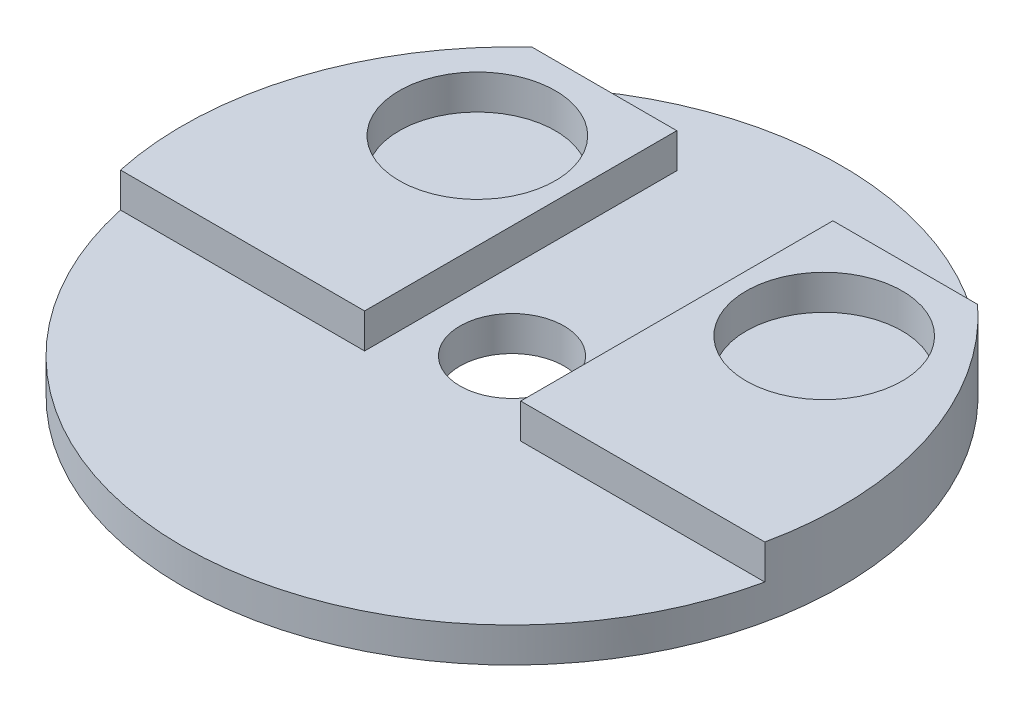
ISO-10303-21;
HEADER;
FILE_DESCRIPTION(('STEP AP214'),'2;1');
FILE_NAME('part.step','',(''),(''),'','','');
FILE_SCHEMA(('AUTOMOTIVE_DESIGN { 1 0 10303 214 1 1 1 1 }'));
ENDSEC;
DATA;
#1=APPLICATION_CONTEXT('core data for automotive mechanical design processes');
#2=APPLICATION_PROTOCOL_DEFINITION('international standard','automotive_design',2000,#1);
#3=PRODUCT_CONTEXT('',#1,'mechanical');
#4=PRODUCT('Part','Part','',(#3));
#5=PRODUCT_RELATED_PRODUCT_CATEGORY('part','',(#4));
#6=PRODUCT_DEFINITION_FORMATION('','',#4);
#7=PRODUCT_DEFINITION_CONTEXT('part definition',#1,'design');
#8=PRODUCT_DEFINITION('design','',#6,#7);
#9=PRODUCT_DEFINITION_SHAPE('','',#8);
#10=(LENGTH_UNIT() NAMED_UNIT(*) SI_UNIT(.MILLI.,.METRE.));
#11=(NAMED_UNIT(*) PLANE_ANGLE_UNIT() SI_UNIT($,.RADIAN.));
#12=(NAMED_UNIT(*) SI_UNIT($,.STERADIAN.) SOLID_ANGLE_UNIT());
#13=UNCERTAINTY_MEASURE_WITH_UNIT(LENGTH_MEASURE(1.E-05),#10,'distance_accuracy_value','');
#14=(GEOMETRIC_REPRESENTATION_CONTEXT(3) GLOBAL_UNCERTAINTY_ASSIGNED_CONTEXT((#13)) GLOBAL_UNIT_ASSIGNED_CONTEXT((#10,
#11,#12)) REPRESENTATION_CONTEXT('',''));
#15=CARTESIAN_POINT('',(0.,0.,0.));
#16=DIRECTION('',(0.,0.,1.));
#17=DIRECTION('',(1.,0.,0.));
#18=AXIS2_PLACEMENT_3D('',#15,#16,#17);
#19=CARTESIAN_POINT('',(0.,0.,0.));
#20=DIRECTION('',(0.,1.,0.));
#21=DIRECTION('',(0.,0.,1.));
#22=AXIS2_PLACEMENT_3D('',#19,#20,#21);
#23=PLANE('',#22);
#24=DIRECTION('',(1.,0.,0.));
#25=VECTOR('',#24,1.);
#26=CARTESIAN_POINT('',(0.,0.,-3.5));
#27=LINE('',#26,#25);
#28=CARTESIAN_POINT('',(-3.21130814466628,0.,-3.5));
#29=VERTEX_POINT('',#28);
#30=CARTESIAN_POINT('',(-1.125,0.,-3.5));
#31=VERTEX_POINT('',#30);
#32=EDGE_CURVE('E59',#29,#31,#27,.T.);
#33=ORIENTED_EDGE('',*,*,#32,.T.);
#34=DIRECTION('',(0.,0.,1.));
#35=VECTOR('',#34,1.);
#36=CARTESIAN_POINT('',(-1.125,0.,0.));
#37=LINE('',#36,#35);
#38=CARTESIAN_POINT('',(-1.125,0.,1.));
#39=VERTEX_POINT('',#38);
#40=EDGE_CURVE('E64',#31,#39,#37,.T.);
#41=ORIENTED_EDGE('',*,*,#40,.T.);
#42=DIRECTION('',(-1.,0.,0.));
#43=VECTOR('',#42,1.);
#44=CARTESIAN_POINT('',(0.,0.,1.));
#45=LINE('',#44,#43);
#46=CARTESIAN_POINT('',(-4.64354390525168,0.,1.));
#47=VERTEX_POINT('',#46);
#48=EDGE_CURVE('E140',#39,#47,#45,.T.);
#49=ORIENTED_EDGE('',*,*,#48,.T.);
#50=CARTESIAN_POINT('',(0.,0.,0.));
#51=DIRECTION('',(0.,1.,0.));
#52=DIRECTION('',(0.,0.,1.));
#53=AXIS2_PLACEMENT_3D('',#50,#51,#52);
#54=CIRCLE('',#53,4.75);
#55=CARTESIAN_POINT('',(4.64354390525168,0.,1.));
#56=VERTEX_POINT('',#55);
#57=EDGE_CURVE('E184',#47,#56,#54,.T.);
#58=ORIENTED_EDGE('',*,*,#57,.T.);
#59=DIRECTION('',(-1.,0.,0.));
#60=VECTOR('',#59,1.);
#61=CARTESIAN_POINT('',(0.,0.,1.));
#62=LINE('',#61,#60);
#63=CARTESIAN_POINT('',(1.125,0.,1.));
#64=VERTEX_POINT('',#63);
#65=EDGE_CURVE('E164',#56,#64,#62,.T.);
#66=ORIENTED_EDGE('',*,*,#65,.T.);
#67=DIRECTION('',(0.,0.,1.));
#68=VECTOR('',#67,1.);
#69=CARTESIAN_POINT('',(1.125,0.,0.));
#70=LINE('',#69,#68);
#71=CARTESIAN_POINT('',(1.125,0.,-3.5));
#72=VERTEX_POINT('',#71);
#73=EDGE_CURVE('E151',#72,#64,#70,.T.);
#74=ORIENTED_EDGE('',*,*,#73,.F.);
#75=DIRECTION('',(1.,0.,0.));
#76=VECTOR('',#75,1.);
#77=CARTESIAN_POINT('',(0.,0.,-3.5));
#78=LINE('',#77,#76);
#79=CARTESIAN_POINT('',(3.21130814466628,0.,-3.5));
#80=VERTEX_POINT('',#79);
#81=EDGE_CURVE('E167',#72,#80,#78,.T.);
#82=ORIENTED_EDGE('',*,*,#81,.T.);
#83=EDGE_CURVE('E188',#80,#29,#54,.T.);
#84=ORIENTED_EDGE('',*,*,#83,.T.);
#85=EDGE_LOOP('',(#33,#41,#49,#58,#66,#74,#82,#84));
#86=FACE_BOUND('',#85,.T.);
#87=CARTESIAN_POINT('',(0.,0.,0.));
#88=DIRECTION('',(0.,1.,0.));
#89=DIRECTION('',(0.,0.,1.));
#90=AXIS2_PLACEMENT_3D('',#87,#88,#89);
#91=CIRCLE('',#90,0.75);
#92=CARTESIAN_POINT('',(0.,0.,0.75));
#93=VERTEX_POINT('',#92);
#94=EDGE_CURVE('E180',#93,#93,#91,.T.);
#95=ORIENTED_EDGE('',*,*,#94,.F.);
#96=EDGE_LOOP('',(#95));
#97=FACE_BOUND('',#96,.T.);
#98=ADVANCED_FACE('F44',(#86,#97),#23,.T.);
#99=CARTESIAN_POINT('',(0.,-0.5,0.));
#100=DIRECTION('',(0.,1.,0.));
#101=DIRECTION('',(0.,0.,1.));
#102=AXIS2_PLACEMENT_3D('',#99,#100,#101);
#103=CYLINDRICAL_SURFACE('',#102,4.75);
#104=CARTESIAN_POINT('',(0.,-0.5,0.));
#105=DIRECTION('',(0.,1.,0.));
#106=DIRECTION('',(0.,0.,1.));
#107=AXIS2_PLACEMENT_3D('',#104,#105,#106);
#108=CIRCLE('',#107,4.75);
#109=CARTESIAN_POINT('',(0.,-0.5,4.75));
#110=VERTEX_POINT('',#109);
#111=EDGE_CURVE('E52',#110,#110,#108,.T.);
#112=ORIENTED_EDGE('',*,*,#111,.T.);
#113=EDGE_LOOP('',(#112));
#114=FACE_BOUND('',#113,.T.);
#115=ORIENTED_EDGE('',*,*,#83,.F.);
#116=DIRECTION('',(0.,-1.,0.));
#117=VECTOR('',#116,1.);
#118=CARTESIAN_POINT('',(3.21130814466628,0.5,-3.5));
#119=LINE('',#118,#117);
#120=CARTESIAN_POINT('',(3.21130814466628,0.5,-3.5));
#121=VERTEX_POINT('',#120);
#122=EDGE_CURVE('E175',#121,#80,#119,.T.);
#123=ORIENTED_EDGE('',*,*,#122,.F.);
#124=CARTESIAN_POINT('',(0.,0.5,0.));
#125=DIRECTION('',(0.,1.,0.));
#126=DIRECTION('',(0.,0.,1.));
#127=AXIS2_PLACEMENT_3D('',#124,#125,#126);
#128=CIRCLE('',#127,4.75);
#129=CARTESIAN_POINT('',(4.64354390525168,0.5,1.));
#130=VERTEX_POINT('',#129);
#131=EDGE_CURVE('E154',#130,#121,#128,.T.);
#132=ORIENTED_EDGE('',*,*,#131,.F.);
#133=DIRECTION('',(0.,-1.,0.));
#134=VECTOR('',#133,1.);
#135=CARTESIAN_POINT('',(4.64354390525168,0.5,1.));
#136=LINE('',#135,#134);
#137=EDGE_CURVE('E177',#130,#56,#136,.T.);
#138=ORIENTED_EDGE('',*,*,#137,.T.);
#139=ORIENTED_EDGE('',*,*,#57,.F.);
#140=DIRECTION('',(0.,-1.,0.));
#141=VECTOR('',#140,1.);
#142=CARTESIAN_POINT('',(-4.64354390525168,0.5,1.));
#143=LINE('',#142,#141);
#144=CARTESIAN_POINT('',(-4.64354390525168,0.5,1.));
#145=VERTEX_POINT('',#144);
#146=EDGE_CURVE('E118',#145,#47,#143,.T.);
#147=ORIENTED_EDGE('',*,*,#146,.F.);
#148=CARTESIAN_POINT('',(0.,0.5,0.));
#149=DIRECTION('',(0.,1.,0.));
#150=DIRECTION('',(0.,0.,1.));
#151=AXIS2_PLACEMENT_3D('',#148,#149,#150);
#152=CIRCLE('',#151,4.75);
#153=CARTESIAN_POINT('',(-3.21130814466628,0.5,-3.5));
#154=VERTEX_POINT('',#153);
#155=EDGE_CURVE('E121',#154,#145,#152,.T.);
#156=ORIENTED_EDGE('',*,*,#155,.F.);
#157=DIRECTION('',(0.,-1.,0.));
#158=VECTOR('',#157,1.);
#159=CARTESIAN_POINT('',(-3.21130814466628,0.5,-3.5));
#160=LINE('',#159,#158);
#161=EDGE_CURVE('E109',#154,#29,#160,.T.);
#162=ORIENTED_EDGE('',*,*,#161,.T.);
#163=EDGE_LOOP('',(#115,#123,#132,#138,#139,#147,#156,#162));
#164=FACE_BOUND('',#163,.T.);
#165=ADVANCED_FACE('F46',(#114,#164),#103,.T.);
#166=CARTESIAN_POINT('',(0.,-0.5,0.));
#167=DIRECTION('',(0.,1.,0.));
#168=DIRECTION('',(0.,0.,1.));
#169=AXIS2_PLACEMENT_3D('',#166,#167,#168);
#170=PLANE('',#169);
#171=CARTESIAN_POINT('',(0.,-0.5,0.));
#172=DIRECTION('',(0.,1.,0.));
#173=DIRECTION('',(0.,0.,1.));
#174=AXIS2_PLACEMENT_3D('',#171,#172,#173);
#175=CIRCLE('',#174,0.75);
#176=CARTESIAN_POINT('',(0.,-0.5,0.75));
#177=VERTEX_POINT('',#176);
#178=EDGE_CURVE('E181',#177,#177,#175,.T.);
#179=ORIENTED_EDGE('',*,*,#178,.T.);
#180=EDGE_LOOP('',(#179));
#181=FACE_BOUND('',#180,.T.);
#182=ORIENTED_EDGE('',*,*,#111,.F.);
#183=EDGE_LOOP('',(#182));
#184=FACE_BOUND('',#183,.T.);
#185=ADVANCED_FACE('F226',(#181,#184),#170,.F.);
#186=CARTESIAN_POINT('',(0.,-0.5,0.));
#187=DIRECTION('',(0.,1.,0.));
#188=DIRECTION('',(0.,0.,1.));
#189=AXIS2_PLACEMENT_3D('',#186,#187,#188);
#190=CYLINDRICAL_SURFACE('',#189,0.75);
#191=ORIENTED_EDGE('',*,*,#178,.F.);
#192=EDGE_LOOP('',(#191));
#193=FACE_BOUND('',#192,.T.);
#194=ORIENTED_EDGE('',*,*,#94,.T.);
#195=EDGE_LOOP('',(#194));
#196=FACE_BOUND('',#195,.T.);
#197=ADVANCED_FACE('F307',(#193,#196),#190,.F.);
#198=CARTESIAN_POINT('',(0.,0.5,1.));
#199=DIRECTION('',(0.,0.,1.));
#200=DIRECTION('',(1.,0.,0.));
#201=AXIS2_PLACEMENT_3D('',#198,#199,#200);
#202=PLANE('',#201);
#203=ORIENTED_EDGE('',*,*,#65,.F.);
#204=ORIENTED_EDGE('',*,*,#137,.F.);
#205=DIRECTION('',(-1.,0.,0.));
#206=VECTOR('',#205,1.);
#207=CARTESIAN_POINT('',(0.,0.5,1.));
#208=LINE('',#207,#206);
#209=CARTESIAN_POINT('',(1.125,0.5,1.));
#210=VERTEX_POINT('',#209);
#211=EDGE_CURVE('E150',#130,#210,#208,.T.);
#212=ORIENTED_EDGE('',*,*,#211,.T.);
#213=DIRECTION('',(0.,-1.,0.));
#214=VECTOR('',#213,1.);
#215=CARTESIAN_POINT('',(1.125,0.5,1.));
#216=LINE('',#215,#214);
#217=EDGE_CURVE('E161',#210,#64,#216,.T.);
#218=ORIENTED_EDGE('',*,*,#217,.T.);
#219=EDGE_LOOP('',(#203,#204,#212,#218));
#220=FACE_BOUND('',#219,.T.);
#221=ADVANCED_FACE('F197',(#220),#202,.T.);
#222=CARTESIAN_POINT('',(0.,0.5,-3.5));
#223=DIRECTION('',(0.,0.,-1.));
#224=DIRECTION('',(-1.,0.,0.));
#225=AXIS2_PLACEMENT_3D('',#222,#223,#224);
#226=PLANE('',#225);
#227=ORIENTED_EDGE('',*,*,#81,.F.);
#228=DIRECTION('',(0.,-1.,0.));
#229=VECTOR('',#228,1.);
#230=CARTESIAN_POINT('',(1.125,0.5,-3.5));
#231=LINE('',#230,#229);
#232=CARTESIAN_POINT('',(1.125,0.5,-3.5));
#233=VERTEX_POINT('',#232);
#234=EDGE_CURVE('E173',#233,#72,#231,.T.);
#235=ORIENTED_EDGE('',*,*,#234,.F.);
#236=DIRECTION('',(1.,0.,0.));
#237=VECTOR('',#236,1.);
#238=CARTESIAN_POINT('',(0.,0.5,-3.5));
#239=LINE('',#238,#237);
#240=EDGE_CURVE('E156',#233,#121,#239,.T.);
#241=ORIENTED_EDGE('',*,*,#240,.T.);
#242=ORIENTED_EDGE('',*,*,#122,.T.);
#243=EDGE_LOOP('',(#227,#235,#241,#242));
#244=FACE_BOUND('',#243,.T.);
#245=ADVANCED_FACE('F205',(#244),#226,.T.);
#246=CARTESIAN_POINT('',(2.5,0.5,-2.));
#247=DIRECTION('',(0.,-1.,0.));
#248=DIRECTION('',(0.,0.,-1.));
#249=AXIS2_PLACEMENT_3D('',#246,#247,#248);
#250=CYLINDRICAL_SURFACE('',#249,1.125);
#251=CARTESIAN_POINT('',(2.5,0.5,-2.));
#252=DIRECTION('',(0.,1.,0.));
#253=DIRECTION('',(0.,0.,1.));
#254=AXIS2_PLACEMENT_3D('',#251,#252,#253);
#255=CIRCLE('',#254,1.125);
#256=CARTESIAN_POINT('',(2.5,0.5,-0.874999999999999));
#257=VERTEX_POINT('',#256);
#258=EDGE_CURVE('E147',#257,#257,#255,.T.);
#259=ORIENTED_EDGE('',*,*,#258,.T.);
#260=EDGE_LOOP('',(#259));
#261=FACE_BOUND('',#260,.T.);
#262=CARTESIAN_POINT('',(2.5,0.,-2.));
#263=DIRECTION('',(0.,1.,0.));
#264=DIRECTION('',(0.,0.,1.));
#265=AXIS2_PLACEMENT_3D('',#262,#263,#264);
#266=CIRCLE('',#265,1.125);
#267=CARTESIAN_POINT('',(2.5,0.,-0.874999999999999));
#268=VERTEX_POINT('',#267);
#269=EDGE_CURVE('E117',#268,#268,#266,.T.);
#270=ORIENTED_EDGE('',*,*,#269,.F.);
#271=EDGE_LOOP('',(#270));
#272=FACE_BOUND('',#271,.T.);
#273=ADVANCED_FACE('F218',(#261,#272),#250,.F.);
#274=CARTESIAN_POINT('',(1.125,0.5,0.));
#275=DIRECTION('',(1.,0.,0.));
#276=DIRECTION('',(0.,0.,-1.));
#277=AXIS2_PLACEMENT_3D('',#274,#275,#276);
#278=PLANE('',#277);
#279=ORIENTED_EDGE('',*,*,#73,.T.);
#280=ORIENTED_EDGE('',*,*,#217,.F.);
#281=DIRECTION('',(0.,0.,1.));
#282=VECTOR('',#281,1.);
#283=CARTESIAN_POINT('',(1.125,0.5,0.));
#284=LINE('',#283,#282);
#285=EDGE_CURVE('E159',#233,#210,#284,.T.);
#286=ORIENTED_EDGE('',*,*,#285,.F.);
#287=ORIENTED_EDGE('',*,*,#234,.T.);
#288=EDGE_LOOP('',(#279,#280,#286,#287));
#289=FACE_BOUND('',#288,.T.);
#290=ADVANCED_FACE('F201',(#289),#278,.F.);
#291=CARTESIAN_POINT('',(0.,0.5,0.));
#292=DIRECTION('',(0.,1.,0.));
#293=DIRECTION('',(0.,0.,1.));
#294=AXIS2_PLACEMENT_3D('',#291,#292,#293);
#295=PLANE('',#294);
#296=ORIENTED_EDGE('',*,*,#258,.F.);
#297=EDGE_LOOP('',(#296));
#298=FACE_BOUND('',#297,.T.);
#299=ORIENTED_EDGE('',*,*,#211,.F.);
#300=ORIENTED_EDGE('',*,*,#131,.T.);
#301=ORIENTED_EDGE('',*,*,#240,.F.);
#302=ORIENTED_EDGE('',*,*,#285,.T.);
#303=EDGE_LOOP('',(#299,#300,#301,#302));
#304=FACE_BOUND('',#303,.T.);
#305=ADVANCED_FACE('F207',(#298,#304),#295,.T.);
#306=ORIENTED_EDGE('',*,*,#269,.T.);
#307=EDGE_LOOP('',(#306));
#308=FACE_BOUND('',#307,.T.);
#309=ADVANCED_FACE('F209',(#308),#23,.T.);
#310=CARTESIAN_POINT('',(0.,0.5,-3.5));
#311=DIRECTION('',(0.,0.,-1.));
#312=DIRECTION('',(-1.,0.,0.));
#313=AXIS2_PLACEMENT_3D('',#310,#311,#312);
#314=PLANE('',#313);
#315=ORIENTED_EDGE('',*,*,#32,.F.);
#316=ORIENTED_EDGE('',*,*,#161,.F.);
#317=DIRECTION('',(1.,0.,0.));
#318=VECTOR('',#317,1.);
#319=CARTESIAN_POINT('',(0.,0.5,-3.5));
#320=LINE('',#319,#318);
#321=CARTESIAN_POINT('',(-1.125,0.5,-3.5));
#322=VERTEX_POINT('',#321);
#323=EDGE_CURVE('E113',#154,#322,#320,.T.);
#324=ORIENTED_EDGE('',*,*,#323,.T.);
#325=DIRECTION('',(0.,-1.,0.));
#326=VECTOR('',#325,1.);
#327=CARTESIAN_POINT('',(-1.125,0.5,-3.5));
#328=LINE('',#327,#326);
#329=EDGE_CURVE('E138',#322,#31,#328,.T.);
#330=ORIENTED_EDGE('',*,*,#329,.T.);
#331=EDGE_LOOP('',(#315,#316,#324,#330));
#332=FACE_BOUND('',#331,.T.);
#333=ADVANCED_FACE('F111',(#332),#314,.T.);
#334=CARTESIAN_POINT('',(0.,0.5,1.));
#335=DIRECTION('',(0.,0.,1.));
#336=DIRECTION('',(1.,0.,0.));
#337=AXIS2_PLACEMENT_3D('',#334,#335,#336);
#338=PLANE('',#337);
#339=ORIENTED_EDGE('',*,*,#48,.F.);
#340=DIRECTION('',(0.,-1.,0.));
#341=VECTOR('',#340,1.);
#342=CARTESIAN_POINT('',(-1.125,0.5,1.));
#343=LINE('',#342,#341);
#344=CARTESIAN_POINT('',(-1.125,0.5,1.));
#345=VERTEX_POINT('',#344);
#346=EDGE_CURVE('E144',#345,#39,#343,.T.);
#347=ORIENTED_EDGE('',*,*,#346,.F.);
#348=DIRECTION('',(-1.,0.,0.));
#349=VECTOR('',#348,1.);
#350=CARTESIAN_POINT('',(0.,0.5,1.));
#351=LINE('',#350,#349);
#352=EDGE_CURVE('E126',#345,#145,#351,.T.);
#353=ORIENTED_EDGE('',*,*,#352,.T.);
#354=ORIENTED_EDGE('',*,*,#146,.T.);
#355=EDGE_LOOP('',(#339,#347,#353,#354));
#356=FACE_BOUND('',#355,.T.);
#357=ADVANCED_FACE('F241',(#356),#338,.T.);
#358=CARTESIAN_POINT('',(-2.5,0.5,-2.));
#359=DIRECTION('',(0.,-1.,0.));
#360=DIRECTION('',(0.,0.,-1.));
#361=AXIS2_PLACEMENT_3D('',#358,#359,#360);
#362=CYLINDRICAL_SURFACE('',#361,1.125);
#363=CARTESIAN_POINT('',(-2.5,0.5,-2.));
#364=DIRECTION('',(0.,1.,0.));
#365=DIRECTION('',(0.,0.,1.));
#366=AXIS2_PLACEMENT_3D('',#363,#364,#365);
#367=CIRCLE('',#366,1.125);
#368=CARTESIAN_POINT('',(-2.5,0.5,-0.875));
#369=VERTEX_POINT('',#368);
#370=EDGE_CURVE('E131',#369,#369,#367,.T.);
#371=ORIENTED_EDGE('',*,*,#370,.T.);
#372=EDGE_LOOP('',(#371));
#373=FACE_BOUND('',#372,.T.);
#374=CARTESIAN_POINT('',(-2.5,0.,-2.));
#375=DIRECTION('',(0.,1.,0.));
#376=DIRECTION('',(0.,0.,1.));
#377=AXIS2_PLACEMENT_3D('',#374,#375,#376);
#378=CIRCLE('',#377,1.125);
#379=CARTESIAN_POINT('',(-2.5,0.,-0.875));
#380=VERTEX_POINT('',#379);
#381=EDGE_CURVE('E12',#380,#380,#378,.F.);
#382=ORIENTED_EDGE('',*,*,#381,.T.);
#383=EDGE_LOOP('',(#382));
#384=FACE_BOUND('',#383,.T.);
#385=ADVANCED_FACE('F239',(#373,#384),#362,.F.);
#386=CARTESIAN_POINT('',(-1.125,0.5,0.));
#387=DIRECTION('',(1.,0.,0.));
#388=DIRECTION('',(0.,0.,-1.));
#389=AXIS2_PLACEMENT_3D('',#386,#387,#388);
#390=PLANE('',#389);
#391=ORIENTED_EDGE('',*,*,#40,.F.);
#392=ORIENTED_EDGE('',*,*,#329,.F.);
#393=DIRECTION('',(0.,0.,1.));
#394=VECTOR('',#393,1.);
#395=CARTESIAN_POINT('',(-1.125,0.5,0.));
#396=LINE('',#395,#394);
#397=EDGE_CURVE('E130',#322,#345,#396,.T.);
#398=ORIENTED_EDGE('',*,*,#397,.T.);
#399=ORIENTED_EDGE('',*,*,#346,.T.);
#400=EDGE_LOOP('',(#391,#392,#398,#399));
#401=FACE_BOUND('',#400,.T.);
#402=ADVANCED_FACE('F234',(#401),#390,.T.);
#403=CARTESIAN_POINT('',(0.,0.5,0.));
#404=DIRECTION('',(0.,1.,0.));
#405=DIRECTION('',(0.,0.,1.));
#406=AXIS2_PLACEMENT_3D('',#403,#404,#405);
#407=PLANE('',#406);
#408=ORIENTED_EDGE('',*,*,#370,.F.);
#409=EDGE_LOOP('',(#408));
#410=FACE_BOUND('',#409,.T.);
#411=ORIENTED_EDGE('',*,*,#323,.F.);
#412=ORIENTED_EDGE('',*,*,#155,.T.);
#413=ORIENTED_EDGE('',*,*,#352,.F.);
#414=ORIENTED_EDGE('',*,*,#397,.F.);
#415=EDGE_LOOP('',(#411,#412,#413,#414));
#416=FACE_BOUND('',#415,.T.);
#417=ADVANCED_FACE('F128',(#410,#416),#407,.T.);
#418=ORIENTED_EDGE('',*,*,#381,.F.);
#419=EDGE_LOOP('',(#418));
#420=FACE_BOUND('',#419,.T.);
#421=ADVANCED_FACE('F217',(#420),#23,.T.);
#422=CLOSED_SHELL('',(#98,#165,#185,#197,#221,#245,#273,#290,#305,#309,#333,#357,#385,#402,#417,#421));
#423=MANIFOLD_SOLID_BREP('B2',#422);
#424=ADVANCED_BREP_SHAPE_REPRESENTATION('',(#18,#423),#14);
#425=SHAPE_DEFINITION_REPRESENTATION(#9,#424);
ENDSEC;
END-ISO-10303-21;
